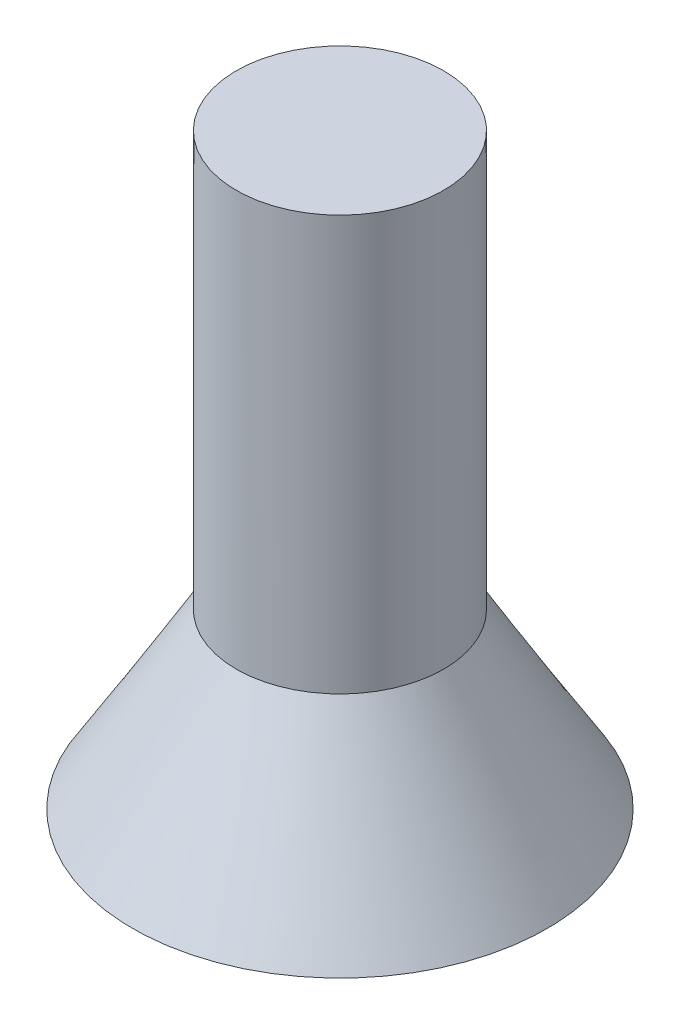
ISO-10303-21;
HEADER;
FILE_DESCRIPTION(('STEP AP214'),'2;1');
FILE_NAME('part.step','',(''),(''),'','','');
FILE_SCHEMA(('AUTOMOTIVE_DESIGN { 1 0 10303 214 1 1 1 1 }'));
ENDSEC;
DATA;
#1=APPLICATION_CONTEXT('core data for automotive mechanical design processes');
#2=APPLICATION_PROTOCOL_DEFINITION('international standard','automotive_design',2000,#1);
#3=PRODUCT_CONTEXT('',#1,'mechanical');
#4=PRODUCT('Part','Part','',(#3));
#5=PRODUCT_RELATED_PRODUCT_CATEGORY('part','',(#4));
#6=PRODUCT_DEFINITION_FORMATION('','',#4);
#7=PRODUCT_DEFINITION_CONTEXT('part definition',#1,'design');
#8=PRODUCT_DEFINITION('design','',#6,#7);
#9=PRODUCT_DEFINITION_SHAPE('','',#8);
#10=(LENGTH_UNIT() NAMED_UNIT(*) SI_UNIT(.MILLI.,.METRE.));
#11=(NAMED_UNIT(*) PLANE_ANGLE_UNIT() SI_UNIT($,.RADIAN.));
#12=(NAMED_UNIT(*) SI_UNIT($,.STERADIAN.) SOLID_ANGLE_UNIT());
#13=UNCERTAINTY_MEASURE_WITH_UNIT(LENGTH_MEASURE(1.E-05),#10,'distance_accuracy_value','');
#14=(GEOMETRIC_REPRESENTATION_CONTEXT(3) GLOBAL_UNCERTAINTY_ASSIGNED_CONTEXT((#13)) GLOBAL_UNIT_ASSIGNED_CONTEXT((#10,
#11,#12)) REPRESENTATION_CONTEXT('',''));
#15=CARTESIAN_POINT('',(0.,0.,0.));
#16=DIRECTION('',(0.,0.,1.));
#17=DIRECTION('',(1.,0.,0.));
#18=AXIS2_PLACEMENT_3D('',#15,#16,#17);
#19=CARTESIAN_POINT('',(0.,0.,0.));
#20=DIRECTION('',(0.,1.,0.));
#21=DIRECTION('',(0.,0.,-1.));
#22=AXIS2_PLACEMENT_3D('',#19,#20,#21);
#23=PLANE('',#22);
#24=DIRECTION('',(-1.,0.,0.));
#25=VECTOR('',#24,1.);
#26=CARTESIAN_POINT('',(0.577350269189625,0.,-1.));
#27=LINE('',#26,#25);
#28=CARTESIAN_POINT('',(0.577350269189625,0.,-1.));
#29=VERTEX_POINT('',#28);
#30=CARTESIAN_POINT('',(-0.577350269189626,0.,-1.));
#31=VERTEX_POINT('',#30);
#32=EDGE_CURVE('E320',#29,#31,#27,.T.);
#33=ORIENTED_EDGE('',*,*,#32,.T.);
#34=DIRECTION('',(-0.5,0.,0.866025403784439));
#35=VECTOR('',#34,1.);
#36=CARTESIAN_POINT('',(-0.577350269189626,0.,-1.));
#37=LINE('',#36,#35);
#38=CARTESIAN_POINT('',(-1.15470053837925,0.,0.));
#39=VERTEX_POINT('',#38);
#40=EDGE_CURVE('E315',#31,#39,#37,.T.);
#41=ORIENTED_EDGE('',*,*,#40,.T.);
#42=DIRECTION('',(0.5,0.,0.866025403784438));
#43=VECTOR('',#42,1.);
#44=CARTESIAN_POINT('',(-1.15470053837925,0.,0.));
#45=LINE('',#44,#43);
#46=CARTESIAN_POINT('',(-0.577350269189625,0.,0.999999999999999));
#47=VERTEX_POINT('',#46);
#48=EDGE_CURVE('E312',#39,#47,#45,.T.);
#49=ORIENTED_EDGE('',*,*,#48,.T.);
#50=DIRECTION('',(1.,0.,0.));
#51=VECTOR('',#50,1.);
#52=CARTESIAN_POINT('',(-0.577350269189625,0.,0.999999999999999));
#53=LINE('',#52,#51);
#54=CARTESIAN_POINT('',(0.577350269189626,0.,0.999999999999999));
#55=VERTEX_POINT('',#54);
#56=EDGE_CURVE('E142',#47,#55,#53,.T.);
#57=ORIENTED_EDGE('',*,*,#56,.T.);
#58=DIRECTION('',(0.5,0.,-0.866025403784439));
#59=VECTOR('',#58,1.);
#60=CARTESIAN_POINT('',(0.577350269189626,0.,0.999999999999999));
#61=LINE('',#60,#59);
#62=CARTESIAN_POINT('',(1.15470053837925,0.,0.));
#63=VERTEX_POINT('',#62);
#64=EDGE_CURVE('E306',#55,#63,#61,.T.);
#65=ORIENTED_EDGE('',*,*,#64,.T.);
#66=DIRECTION('',(-0.5,0.,-0.866025403784439));
#67=VECTOR('',#66,1.);
#68=CARTESIAN_POINT('',(1.15470053837925,0.,0.));
#69=LINE('',#68,#67);
#70=EDGE_CURVE('E322',#63,#29,#69,.T.);
#71=ORIENTED_EDGE('',*,*,#70,.T.);
#72=EDGE_LOOP('',(#33,#41,#49,#57,#65,#71));
#73=FACE_BOUND('',#72,.T.);
#74=CARTESIAN_POINT('',(-2.6965657370898,0.,-1.31473694157932));
#75=CARTESIAN_POINT('',(-5.32603962024845,0.,4.07839453260027));
#76=CARTESIAN_POINT('',(0.0670918539311498,0.,6.70786841575892));
#77=CARTESIAN_POINT('',(2.6965657370898,0.,1.31473694157932));
#78=CARTESIAN_POINT('',(5.32603962024845,0.,-4.07839453260027));
#79=CARTESIAN_POINT('',(-0.0670918539311506,0.,-6.70786841575892));
#80=CARTESIAN_POINT('',(-2.6965657370898,0.,-1.31473694157932));
#81=(BOUNDED_CURVE() B_SPLINE_CURVE(3,(#74,#75,#76,#77,#78,#79,#80),.UNSPECIFIED.,.T.,
.F.) B_SPLINE_CURVE_WITH_KNOTS((4,3,4),(0.,0.5,1.),
.UNSPECIFIED.) CURVE() GEOMETRIC_REPRESENTATION_ITEM() RATIONAL_B_SPLINE_CURVE((1.,
0.333333333333333,0.333333333333333,1.,0.333333333333333,0.333333333333333,1.)) REPRESENTATION_ITEM(''));
#82=CARTESIAN_POINT('',(-2.6965657370898,0.,-1.31473694157932));
#83=VERTEX_POINT('',#82);
#84=EDGE_CURVE('E70',#83,#83,#81,.F.);
#85=ORIENTED_EDGE('',*,*,#84,.T.);
#86=EDGE_LOOP('',(#85));
#87=FACE_BOUND('',#86,.T.);
#88=ADVANCED_FACE('F55',(#73,#87),#23,.F.);
#89=CARTESIAN_POINT('',(-2.6965657370898,0.,-1.31473694157932));
#90=CARTESIAN_POINT('',(-1.46387514290812,2.5,-0.327214862094814));
#91=CARTESIAN_POINT('',(-0.0670918539311506,0.,-6.70786841575892));
#92=CARTESIAN_POINT('',(-0.809445418718492,2.5,-3.25496514791106));
#93=CARTESIAN_POINT('',(5.32603962024845,0.,-4.07839453260027));
#94=CARTESIAN_POINT('',(2.11830486709775,2.5,-2.60053542372143));
#95=CARTESIAN_POINT('',(2.6965657370898,0.,1.31473694157932));
#96=CARTESIAN_POINT('',(1.46387514290812,2.5,0.327214862094814));
#97=CARTESIAN_POINT('',(0.0670918539311498,0.,6.70786841575892));
#98=CARTESIAN_POINT('',(0.809445418718492,2.5,3.25496514791106));
#99=CARTESIAN_POINT('',(-5.32603962024845,0.,4.07839453260027));
#100=CARTESIAN_POINT('',(-2.11830486709775,2.5,2.60053542372143));
#101=CARTESIAN_POINT('',(-2.6965657370898,0.,-1.31473694157932));
#102=CARTESIAN_POINT('',(-1.46387514290812,2.5,-0.327214862094814));
#103=(BOUNDED_SURFACE() B_SPLINE_SURFACE(3,1,((#89,#90),(#91,#92),(#93,#94),(#95,#96),(#97,#98),
(#99,#100),(#101,#102)),.UNSPECIFIED.,.T.,.F.,.F.) B_SPLINE_SURFACE_WITH_KNOTS((4,3,4),(2,2),
(0.,0.5,1.),(0.,1.),
.UNSPECIFIED.) GEOMETRIC_REPRESENTATION_ITEM() RATIONAL_B_SPLINE_SURFACE(((1.,1.),
(0.333333333333333,0.333333333333333),(0.333333333333333,0.333333333333333),(1.,1.),
(0.333333333333333,0.333333333333333),(0.333333333333333,0.333333333333333),(1.,1.))) REPRESENTATION_ITEM('') SURFACE());
#104=CARTESIAN_POINT('',(-1.46387514290817,2.49999999999989,-0.327214862094857));
#105=CARTESIAN_POINT('',(-0.809445418718461,2.49999999999989,-3.2549651479112));
#106=CARTESIAN_POINT('',(2.11830486709789,2.49999999999989,-2.60053542372149));
#107=CARTESIAN_POINT('',(1.46387514290817,2.49999999999989,0.327214862094857));
#108=CARTESIAN_POINT('',(0.80944541871846,2.49999999999989,3.2549651479112));
#109=CARTESIAN_POINT('',(-2.11830486709789,2.49999999999989,2.60053542372149));
#110=CARTESIAN_POINT('',(-1.46387514290817,2.49999999999989,-0.327214862094857));
#111=(BOUNDED_CURVE() B_SPLINE_CURVE(3,(#104,#105,#106,#107,#108,#109,#110),.UNSPECIFIED.,.T.,
.F.) B_SPLINE_CURVE_WITH_KNOTS((4,3,4),(0.,0.5,1.),
.UNSPECIFIED.) CURVE() GEOMETRIC_REPRESENTATION_ITEM() RATIONAL_B_SPLINE_CURVE((1.,
0.333333333333333,0.333333333333333,1.,0.333333333333333,0.333333333333333,1.)) REPRESENTATION_ITEM(''));
#112=CARTESIAN_POINT('',(-1.46387514290817,2.49999999999989,-0.327214862094857));
#113=VERTEX_POINT('',#112);
#114=EDGE_CURVE('E12',#113,#113,#111,.T.);
#115=ORIENTED_EDGE('',*,*,#84,.F.);
#116=EDGE_LOOP('',(#115));
#117=FACE_BOUND('',#116,.T.);
#118=ORIENTED_EDGE('',*,*,#114,.T.);
#119=EDGE_LOOP('',(#118));
#120=FACE_BOUND('',#119,.T.);
#121=ADVANCED_FACE('F57',(#117,#120),#103,.F.);
#122=CARTESIAN_POINT('',(0.,8.5,0.));
#123=DIRECTION('',(0.,-1.,0.));
#124=DIRECTION('',(0.,0.,1.));
#125=AXIS2_PLACEMENT_3D('',#122,#123,#124);
#126=CYLINDRICAL_SURFACE('',#125,1.5);
#127=CARTESIAN_POINT('',(0.,8.5,0.));
#128=DIRECTION('',(0.,-1.,0.));
#129=DIRECTION('',(0.,0.,-1.));
#130=AXIS2_PLACEMENT_3D('',#127,#128,#129);
#131=CIRCLE('',#130,1.5);
#132=CARTESIAN_POINT('',(0.,8.5,-1.5));
#133=VERTEX_POINT('',#132);
#134=EDGE_CURVE('E160',#133,#133,#131,.T.);
#135=ORIENTED_EDGE('',*,*,#134,.T.);
#136=EDGE_LOOP('',(#135));
#137=FACE_BOUND('',#136,.T.);
#138=ORIENTED_EDGE('',*,*,#114,.F.);
#139=EDGE_LOOP('',(#138));
#140=FACE_BOUND('',#139,.T.);
#141=ADVANCED_FACE('F199',(#137,#140),#126,.T.);
#142=CARTESIAN_POINT('',(0.,8.5,0.));
#143=DIRECTION('',(0.,1.,0.));
#144=DIRECTION('',(0.,0.,-1.));
#145=AXIS2_PLACEMENT_3D('',#142,#143,#144);
#146=PLANE('',#145);
#147=ORIENTED_EDGE('',*,*,#134,.F.);
#148=EDGE_LOOP('',(#147));
#149=FACE_BOUND('',#148,.T.);
#150=ADVANCED_FACE('F203',(#149),#146,.T.);
#151=CARTESIAN_POINT('',(1.15470053837925,0.5,0.));
#152=DIRECTION('',(0.866025403784439,0.,-0.5));
#153=DIRECTION('',(0.5,0.,0.866025403784439));
#154=AXIS2_PLACEMENT_3D('',#151,#152,#153);
#155=PLANE('',#154);
#156=ORIENTED_EDGE('',*,*,#70,.F.);
#157=DIRECTION('',(0.,-1.,0.));
#158=VECTOR('',#157,1.);
#159=CARTESIAN_POINT('',(1.15470053837925,0.5,0.));
#160=LINE('',#159,#158);
#161=CARTESIAN_POINT('',(1.15470053837925,0.5,0.));
#162=VERTEX_POINT('',#161);
#163=EDGE_CURVE('E108',#162,#63,#160,.T.);
#164=ORIENTED_EDGE('',*,*,#163,.F.);
#165=DIRECTION('',(-0.5,0.,-0.866025403784439));
#166=VECTOR('',#165,1.);
#167=CARTESIAN_POINT('',(1.15470053837925,0.5,0.));
#168=LINE('',#167,#166);
#169=CARTESIAN_POINT('',(0.577350269189625,0.5,-1.));
#170=VERTEX_POINT('',#169);
#171=EDGE_CURVE('E308',#162,#170,#168,.T.);
#172=ORIENTED_EDGE('',*,*,#171,.T.);
#173=DIRECTION('',(0.,-1.,0.));
#174=VECTOR('',#173,1.);
#175=CARTESIAN_POINT('',(0.577350269189625,0.5,-1.));
#176=LINE('',#175,#174);
#177=EDGE_CURVE('E77',#170,#29,#176,.T.);
#178=ORIENTED_EDGE('',*,*,#177,.T.);
#179=EDGE_LOOP('',(#156,#164,#172,#178));
#180=FACE_BOUND('',#179,.T.);
#181=ADVANCED_FACE('F207',(#180),#155,.F.);
#182=CARTESIAN_POINT('',(0.577350269189626,0.5,0.999999999999999));
#183=DIRECTION('',(0.866025403784438,0.,0.5));
#184=DIRECTION('',(-0.5,0.,0.866025403784439));
#185=AXIS2_PLACEMENT_3D('',#182,#183,#184);
#186=PLANE('',#185);
#187=ORIENTED_EDGE('',*,*,#64,.F.);
#188=DIRECTION('',(0.,-1.,0.));
#189=VECTOR('',#188,1.);
#190=CARTESIAN_POINT('',(0.577350269189626,0.5,0.999999999999999));
#191=LINE('',#190,#189);
#192=CARTESIAN_POINT('',(0.577350269189626,0.5,0.999999999999999));
#193=VERTEX_POINT('',#192);
#194=EDGE_CURVE('E145',#193,#55,#191,.T.);
#195=ORIENTED_EDGE('',*,*,#194,.F.);
#196=DIRECTION('',(0.5,0.,-0.866025403784439));
#197=VECTOR('',#196,1.);
#198=CARTESIAN_POINT('',(0.577350269189626,0.5,0.999999999999999));
#199=LINE('',#198,#197);
#200=EDGE_CURVE('E86',#193,#162,#199,.T.);
#201=ORIENTED_EDGE('',*,*,#200,.T.);
#202=ORIENTED_EDGE('',*,*,#163,.T.);
#203=EDGE_LOOP('',(#187,#195,#201,#202));
#204=FACE_BOUND('',#203,.T.);
#205=ADVANCED_FACE('F211',(#204),#186,.F.);
#206=CARTESIAN_POINT('',(-0.577350269189625,0.5,0.999999999999999));
#207=DIRECTION('',(0.,0.,1.));
#208=DIRECTION('',(-1.,0.,0.));
#209=AXIS2_PLACEMENT_3D('',#206,#207,#208);
#210=PLANE('',#209);
#211=ORIENTED_EDGE('',*,*,#56,.F.);
#212=DIRECTION('',(0.,-1.,0.));
#213=VECTOR('',#212,1.);
#214=CARTESIAN_POINT('',(-0.577350269189625,0.5,0.999999999999999));
#215=LINE('',#214,#213);
#216=CARTESIAN_POINT('',(-0.577350269189625,0.5,0.999999999999999));
#217=VERTEX_POINT('',#216);
#218=EDGE_CURVE('E129',#217,#47,#215,.T.);
#219=ORIENTED_EDGE('',*,*,#218,.F.);
#220=DIRECTION('',(1.,0.,0.));
#221=VECTOR('',#220,1.);
#222=CARTESIAN_POINT('',(-0.577350269189625,0.5,0.999999999999999));
#223=LINE('',#222,#221);
#224=EDGE_CURVE('E133',#217,#193,#223,.T.);
#225=ORIENTED_EDGE('',*,*,#224,.T.);
#226=ORIENTED_EDGE('',*,*,#194,.T.);
#227=EDGE_LOOP('',(#211,#219,#225,#226));
#228=FACE_BOUND('',#227,.T.);
#229=ADVANCED_FACE('F140',(#228),#210,.F.);
#230=CARTESIAN_POINT('',(-1.15470053837925,0.5,0.));
#231=DIRECTION('',(-0.866025403784438,0.,0.5));
#232=DIRECTION('',(-0.5,0.,-0.866025403784439));
#233=AXIS2_PLACEMENT_3D('',#230,#231,#232);
#234=PLANE('',#233);
#235=ORIENTED_EDGE('',*,*,#48,.F.);
#236=DIRECTION('',(0.,-1.,0.));
#237=VECTOR('',#236,1.);
#238=CARTESIAN_POINT('',(-1.15470053837925,0.5,0.));
#239=LINE('',#238,#237);
#240=CARTESIAN_POINT('',(-1.15470053837925,0.5,0.));
#241=VERTEX_POINT('',#240);
#242=EDGE_CURVE('E131',#241,#39,#239,.T.);
#243=ORIENTED_EDGE('',*,*,#242,.F.);
#244=DIRECTION('',(0.5,0.,0.866025403784438));
#245=VECTOR('',#244,1.);
#246=CARTESIAN_POINT('',(-1.15470053837925,0.5,0.));
#247=LINE('',#246,#245);
#248=EDGE_CURVE('E124',#241,#217,#247,.T.);
#249=ORIENTED_EDGE('',*,*,#248,.T.);
#250=ORIENTED_EDGE('',*,*,#218,.T.);
#251=EDGE_LOOP('',(#235,#243,#249,#250));
#252=FACE_BOUND('',#251,.T.);
#253=ADVANCED_FACE('F127',(#252),#234,.F.);
#254=CARTESIAN_POINT('',(-0.577350269189626,0.5,-1.));
#255=DIRECTION('',(-0.866025403784439,0.,-0.5));
#256=DIRECTION('',(0.5,0.,-0.866025403784439));
#257=AXIS2_PLACEMENT_3D('',#254,#255,#256);
#258=PLANE('',#257);
#259=ORIENTED_EDGE('',*,*,#40,.F.);
#260=DIRECTION('',(0.,-1.,0.));
#261=VECTOR('',#260,1.);
#262=CARTESIAN_POINT('',(-0.577350269189626,0.5,-1.));
#263=LINE('',#262,#261);
#264=CARTESIAN_POINT('',(-0.577350269189626,0.5,-1.));
#265=VERTEX_POINT('',#264);
#266=EDGE_CURVE('E152',#265,#31,#263,.T.);
#267=ORIENTED_EDGE('',*,*,#266,.F.);
#268=DIRECTION('',(-0.5,0.,0.866025403784439));
#269=VECTOR('',#268,1.);
#270=CARTESIAN_POINT('',(-0.577350269189626,0.5,-1.));
#271=LINE('',#270,#269);
#272=EDGE_CURVE('E134',#265,#241,#271,.T.);
#273=ORIENTED_EDGE('',*,*,#272,.T.);
#274=ORIENTED_EDGE('',*,*,#242,.T.);
#275=EDGE_LOOP('',(#259,#267,#273,#274));
#276=FACE_BOUND('',#275,.T.);
#277=ADVANCED_FACE('F215',(#276),#258,.F.);
#278=CARTESIAN_POINT('',(0.577350269189625,0.5,-1.));
#279=DIRECTION('',(0.,0.,-1.));
#280=DIRECTION('',(1.,0.,0.));
#281=AXIS2_PLACEMENT_3D('',#278,#279,#280);
#282=PLANE('',#281);
#283=ORIENTED_EDGE('',*,*,#32,.F.);
#284=ORIENTED_EDGE('',*,*,#177,.F.);
#285=DIRECTION('',(-1.,0.,0.));
#286=VECTOR('',#285,1.);
#287=CARTESIAN_POINT('',(0.577350269189625,0.5,-1.));
#288=LINE('',#287,#286);
#289=EDGE_CURVE('E115',#170,#265,#288,.T.);
#290=ORIENTED_EDGE('',*,*,#289,.T.);
#291=ORIENTED_EDGE('',*,*,#266,.T.);
#292=EDGE_LOOP('',(#283,#284,#290,#291));
#293=FACE_BOUND('',#292,.T.);
#294=ADVANCED_FACE('F212',(#293),#282,.F.);
#295=CARTESIAN_POINT('',(0.,0.5,0.));
#296=DIRECTION('',(0.,-1.,0.));
#297=DIRECTION('',(0.,0.,1.));
#298=AXIS2_PLACEMENT_3D('',#295,#296,#297);
#299=PLANE('',#298);
#300=ORIENTED_EDGE('',*,*,#171,.F.);
#301=ORIENTED_EDGE('',*,*,#200,.F.);
#302=ORIENTED_EDGE('',*,*,#224,.F.);
#303=ORIENTED_EDGE('',*,*,#248,.F.);
#304=ORIENTED_EDGE('',*,*,#272,.F.);
#305=ORIENTED_EDGE('',*,*,#289,.F.);
#306=EDGE_LOOP('',(#300,#301,#302,#303,#304,#305));
#307=FACE_BOUND('',#306,.T.);
#308=ADVANCED_FACE('F136',(#307),#299,.T.);
#309=CLOSED_SHELL('',(#88,#121,#141,#150,#181,#205,#229,#253,#277,#294,#308));
#310=MANIFOLD_SOLID_BREP('B2',#309);
#311=ADVANCED_BREP_SHAPE_REPRESENTATION('',(#18,#310),#14);
#312=SHAPE_DEFINITION_REPRESENTATION(#9,#311);
ENDSEC;
END-ISO-10303-21;
